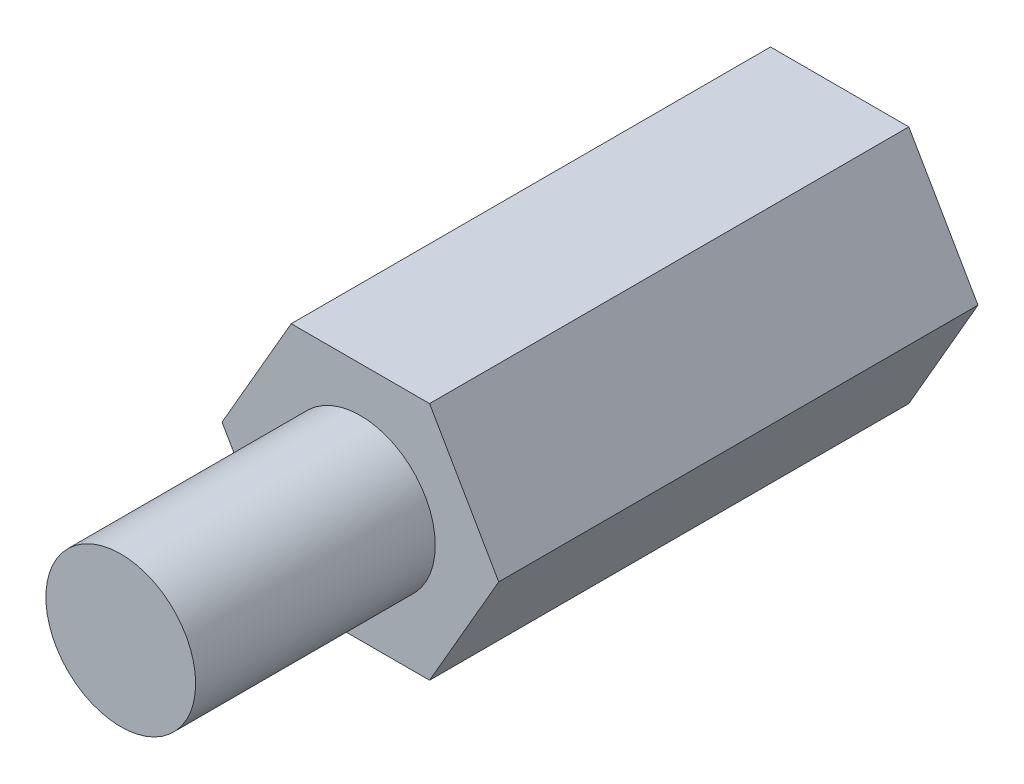
ISO-10303-21;
HEADER;
FILE_DESCRIPTION(('STEP AP214'),'2;1');
FILE_NAME('part.step','',(''),(''),'','','');
FILE_SCHEMA(('AUTOMOTIVE_DESIGN { 1 0 10303 214 1 1 1 1 }'));
ENDSEC;
DATA;
#1=APPLICATION_CONTEXT('core data for automotive mechanical design processes');
#2=APPLICATION_PROTOCOL_DEFINITION('international standard','automotive_design',2000,#1);
#3=PRODUCT_CONTEXT('',#1,'mechanical');
#4=PRODUCT('Part','Part','',(#3));
#5=PRODUCT_RELATED_PRODUCT_CATEGORY('part','',(#4));
#6=PRODUCT_DEFINITION_FORMATION('','',#4);
#7=PRODUCT_DEFINITION_CONTEXT('part definition',#1,'design');
#8=PRODUCT_DEFINITION('design','',#6,#7);
#9=PRODUCT_DEFINITION_SHAPE('','',#8);
#10=(LENGTH_UNIT() NAMED_UNIT(*) SI_UNIT(.MILLI.,.METRE.));
#11=(NAMED_UNIT(*) PLANE_ANGLE_UNIT() SI_UNIT($,.RADIAN.));
#12=(NAMED_UNIT(*) SI_UNIT($,.STERADIAN.) SOLID_ANGLE_UNIT());
#13=UNCERTAINTY_MEASURE_WITH_UNIT(LENGTH_MEASURE(1.E-05),#10,'distance_accuracy_value','');
#14=(GEOMETRIC_REPRESENTATION_CONTEXT(3) GLOBAL_UNCERTAINTY_ASSIGNED_CONTEXT((#13)) GLOBAL_UNIT_ASSIGNED_CONTEXT((#10,
#11,#12)) REPRESENTATION_CONTEXT('',''));
#15=CARTESIAN_POINT('',(0.,0.,0.));
#16=DIRECTION('',(0.,0.,1.));
#17=DIRECTION('',(1.,0.,0.));
#18=AXIS2_PLACEMENT_3D('',#15,#16,#17);
#19=CARTESIAN_POINT('',(-2.3094010767585,0.,8.));
#20=DIRECTION('',(0.866025403784439,0.5,0.));
#21=DIRECTION('',(-0.5,0.866025403784439,0.));
#22=AXIS2_PLACEMENT_3D('',#19,#20,#21);
#23=PLANE('',#22);
#24=DIRECTION('',(0.5,-0.866025403784439,0.));
#25=VECTOR('',#24,1.);
#26=CARTESIAN_POINT('',(-2.3094010767585,0.,0.));
#27=LINE('',#26,#25);
#28=CARTESIAN_POINT('',(-2.3094010767585,0.,0.));
#29=VERTEX_POINT('',#28);
#30=CARTESIAN_POINT('',(-1.15470053837925,-2.,0.));
#31=VERTEX_POINT('',#30);
#32=EDGE_CURVE('E125',#29,#31,#27,.T.);
#33=ORIENTED_EDGE('',*,*,#32,.T.);
#34=DIRECTION('',(0.,0.,-1.));
#35=VECTOR('',#34,1.);
#36=CARTESIAN_POINT('',(-1.15470053837925,-2.,8.));
#37=LINE('',#36,#35);
#38=CARTESIAN_POINT('',(-1.15470053837925,-2.,8.));
#39=VERTEX_POINT('',#38);
#40=EDGE_CURVE('E11',#39,#31,#37,.T.);
#41=ORIENTED_EDGE('',*,*,#40,.F.);
#42=DIRECTION('',(0.5,-0.866025403784439,0.));
#43=VECTOR('',#42,1.);
#44=CARTESIAN_POINT('',(-2.3094010767585,0.,8.));
#45=LINE('',#44,#43);
#46=CARTESIAN_POINT('',(-2.3094010767585,0.,8.));
#47=VERTEX_POINT('',#46);
#48=EDGE_CURVE('E136',#47,#39,#45,.T.);
#49=ORIENTED_EDGE('',*,*,#48,.F.);
#50=DIRECTION('',(0.,0.,-1.));
#51=VECTOR('',#50,1.);
#52=CARTESIAN_POINT('',(-2.3094010767585,0.,8.));
#53=LINE('',#52,#51);
#54=EDGE_CURVE('E121',#47,#29,#53,.T.);
#55=ORIENTED_EDGE('',*,*,#54,.T.);
#56=EDGE_LOOP('',(#33,#41,#49,#55));
#57=FACE_BOUND('',#56,.T.);
#58=ADVANCED_FACE('F39',(#57),#23,.F.);
#59=CARTESIAN_POINT('',(-1.15470053837925,-2.,8.));
#60=DIRECTION('',(0.,1.,0.));
#61=DIRECTION('',(0.,0.,1.));
#62=AXIS2_PLACEMENT_3D('',#59,#60,#61);
#63=PLANE('',#62);
#64=DIRECTION('',(1.,0.,0.));
#65=VECTOR('',#64,1.);
#66=CARTESIAN_POINT('',(-1.15470053837925,-2.,0.));
#67=LINE('',#66,#65);
#68=CARTESIAN_POINT('',(1.15470053837925,-2.,0.));
#69=VERTEX_POINT('',#68);
#70=EDGE_CURVE('E128',#31,#69,#67,.T.);
#71=ORIENTED_EDGE('',*,*,#70,.T.);
#72=DIRECTION('',(0.,0.,-1.));
#73=VECTOR('',#72,1.);
#74=CARTESIAN_POINT('',(1.15470053837925,-2.,8.));
#75=LINE('',#74,#73);
#76=CARTESIAN_POINT('',(1.15470053837925,-2.,8.));
#77=VERTEX_POINT('',#76);
#78=EDGE_CURVE('E47',#77,#69,#75,.T.);
#79=ORIENTED_EDGE('',*,*,#78,.F.);
#80=DIRECTION('',(1.,0.,0.));
#81=VECTOR('',#80,1.);
#82=CARTESIAN_POINT('',(-1.15470053837925,-2.,8.));
#83=LINE('',#82,#81);
#84=EDGE_CURVE('E93',#39,#77,#83,.T.);
#85=ORIENTED_EDGE('',*,*,#84,.F.);
#86=ORIENTED_EDGE('',*,*,#40,.T.);
#87=EDGE_LOOP('',(#71,#79,#85,#86));
#88=FACE_BOUND('',#87,.T.);
#89=ADVANCED_FACE('F161',(#88),#63,.F.);
#90=CARTESIAN_POINT('',(1.15470053837925,-2.,8.));
#91=DIRECTION('',(-0.866025403784439,0.5,0.));
#92=DIRECTION('',(-0.5,-0.866025403784439,0.));
#93=AXIS2_PLACEMENT_3D('',#90,#91,#92);
#94=PLANE('',#93);
#95=DIRECTION('',(0.5,0.866025403784439,0.));
#96=VECTOR('',#95,1.);
#97=CARTESIAN_POINT('',(1.15470053837925,-2.,0.));
#98=LINE('',#97,#96);
#99=CARTESIAN_POINT('',(2.3094010767585,0.,0.));
#100=VERTEX_POINT('',#99);
#101=EDGE_CURVE('E131',#69,#100,#98,.T.);
#102=ORIENTED_EDGE('',*,*,#101,.T.);
#103=DIRECTION('',(0.,0.,-1.));
#104=VECTOR('',#103,1.);
#105=CARTESIAN_POINT('',(2.3094010767585,0.,8.));
#106=LINE('',#105,#104);
#107=CARTESIAN_POINT('',(2.3094010767585,0.,8.));
#108=VERTEX_POINT('',#107);
#109=EDGE_CURVE('E116',#108,#100,#106,.T.);
#110=ORIENTED_EDGE('',*,*,#109,.F.);
#111=DIRECTION('',(0.5,0.866025403784439,0.));
#112=VECTOR('',#111,1.);
#113=CARTESIAN_POINT('',(1.15470053837925,-2.,8.));
#114=LINE('',#113,#112);
#115=EDGE_CURVE('E107',#77,#108,#114,.T.);
#116=ORIENTED_EDGE('',*,*,#115,.F.);
#117=ORIENTED_EDGE('',*,*,#78,.T.);
#118=EDGE_LOOP('',(#102,#110,#116,#117));
#119=FACE_BOUND('',#118,.T.);
#120=ADVANCED_FACE('F142',(#119),#94,.F.);
#121=CARTESIAN_POINT('',(2.3094010767585,0.,8.));
#122=DIRECTION('',(-0.866025403784438,-0.5,0.));
#123=DIRECTION('',(0.5,-0.866025403784438,0.));
#124=AXIS2_PLACEMENT_3D('',#121,#122,#123);
#125=PLANE('',#124);
#126=DIRECTION('',(-0.5,0.866025403784438,0.));
#127=VECTOR('',#126,1.);
#128=CARTESIAN_POINT('',(2.3094010767585,0.,0.));
#129=LINE('',#128,#127);
#130=CARTESIAN_POINT('',(1.15470053837925,2.,0.));
#131=VERTEX_POINT('',#130);
#132=EDGE_CURVE('E115',#100,#131,#129,.T.);
#133=ORIENTED_EDGE('',*,*,#132,.T.);
#134=DIRECTION('',(0.,0.,-1.));
#135=VECTOR('',#134,1.);
#136=CARTESIAN_POINT('',(1.15470053837925,2.,8.));
#137=LINE('',#136,#135);
#138=CARTESIAN_POINT('',(1.15470053837925,2.,8.));
#139=VERTEX_POINT('',#138);
#140=EDGE_CURVE('E112',#139,#131,#137,.T.);
#141=ORIENTED_EDGE('',*,*,#140,.F.);
#142=DIRECTION('',(-0.5,0.866025403784438,0.));
#143=VECTOR('',#142,1.);
#144=CARTESIAN_POINT('',(2.3094010767585,0.,8.));
#145=LINE('',#144,#143);
#146=EDGE_CURVE('E101',#108,#139,#145,.T.);
#147=ORIENTED_EDGE('',*,*,#146,.F.);
#148=ORIENTED_EDGE('',*,*,#109,.T.);
#149=EDGE_LOOP('',(#133,#141,#147,#148));
#150=FACE_BOUND('',#149,.T.);
#151=ADVANCED_FACE('F113',(#150),#125,.F.);
#152=CARTESIAN_POINT('',(1.15470053837925,2.,8.));
#153=DIRECTION('',(0.,-1.,0.));
#154=DIRECTION('',(1.,0.,0.));
#155=AXIS2_PLACEMENT_3D('',#152,#153,#154);
#156=PLANE('',#155);
#157=DIRECTION('',(-1.,0.,0.));
#158=VECTOR('',#157,1.);
#159=CARTESIAN_POINT('',(1.15470053837925,2.,0.));
#160=LINE('',#159,#158);
#161=CARTESIAN_POINT('',(-1.15470053837925,2.,0.));
#162=VERTEX_POINT('',#161);
#163=EDGE_CURVE('E79',#131,#162,#160,.T.);
#164=ORIENTED_EDGE('',*,*,#163,.T.);
#165=DIRECTION('',(0.,0.,-1.));
#166=VECTOR('',#165,1.);
#167=CARTESIAN_POINT('',(-1.15470053837925,2.,8.));
#168=LINE('',#167,#166);
#169=CARTESIAN_POINT('',(-1.15470053837925,2.,8.));
#170=VERTEX_POINT('',#169);
#171=EDGE_CURVE('E117',#170,#162,#168,.T.);
#172=ORIENTED_EDGE('',*,*,#171,.F.);
#173=DIRECTION('',(-1.,0.,0.));
#174=VECTOR('',#173,1.);
#175=CARTESIAN_POINT('',(1.15470053837925,2.,8.));
#176=LINE('',#175,#174);
#177=EDGE_CURVE('E105',#139,#170,#176,.T.);
#178=ORIENTED_EDGE('',*,*,#177,.F.);
#179=ORIENTED_EDGE('',*,*,#140,.T.);
#180=EDGE_LOOP('',(#164,#172,#178,#179));
#181=FACE_BOUND('',#180,.T.);
#182=ADVANCED_FACE('F119',(#181),#156,.F.);
#183=CARTESIAN_POINT('',(-1.15470053837925,2.,8.));
#184=DIRECTION('',(0.866025403784439,-0.5,0.));
#185=DIRECTION('',(0.5,0.866025403784439,0.));
#186=AXIS2_PLACEMENT_3D('',#183,#184,#185);
#187=PLANE('',#186);
#188=DIRECTION('',(-0.5,-0.866025403784439,0.));
#189=VECTOR('',#188,1.);
#190=CARTESIAN_POINT('',(-1.15470053837925,2.,0.));
#191=LINE('',#190,#189);
#192=EDGE_CURVE('E85',#162,#29,#191,.T.);
#193=ORIENTED_EDGE('',*,*,#192,.T.);
#194=ORIENTED_EDGE('',*,*,#54,.F.);
#195=DIRECTION('',(-0.5,-0.866025403784439,0.));
#196=VECTOR('',#195,1.);
#197=CARTESIAN_POINT('',(-1.15470053837925,2.,8.));
#198=LINE('',#197,#196);
#199=EDGE_CURVE('E55',#170,#47,#198,.T.);
#200=ORIENTED_EDGE('',*,*,#199,.F.);
#201=ORIENTED_EDGE('',*,*,#171,.T.);
#202=EDGE_LOOP('',(#193,#194,#200,#201));
#203=FACE_BOUND('',#202,.T.);
#204=ADVANCED_FACE('F149',(#203),#187,.F.);
#205=CARTESIAN_POINT('',(0.,0.,8.));
#206=DIRECTION('',(0.,0.,1.));
#207=DIRECTION('',(1.,0.,0.));
#208=AXIS2_PLACEMENT_3D('',#205,#206,#207);
#209=PLANE('',#208);
#210=CARTESIAN_POINT('',(0.,0.,8.));
#211=DIRECTION('',(0.,0.,1.));
#212=DIRECTION('',(1.,0.,0.));
#213=AXIS2_PLACEMENT_3D('',#210,#211,#212);
#214=CIRCLE('',#213,1.25);
#215=CARTESIAN_POINT('',(1.25,0.,8.));
#216=VERTEX_POINT('',#215);
#217=EDGE_CURVE('E251',#216,#216,#214,.T.);
#218=ORIENTED_EDGE('',*,*,#217,.F.);
#219=EDGE_LOOP('',(#218));
#220=FACE_BOUND('',#219,.T.);
#221=ORIENTED_EDGE('',*,*,#48,.T.);
#222=ORIENTED_EDGE('',*,*,#84,.T.);
#223=ORIENTED_EDGE('',*,*,#115,.T.);
#224=ORIENTED_EDGE('',*,*,#146,.T.);
#225=ORIENTED_EDGE('',*,*,#177,.T.);
#226=ORIENTED_EDGE('',*,*,#199,.T.);
#227=EDGE_LOOP('',(#221,#222,#223,#224,#225,#226));
#228=FACE_BOUND('',#227,.T.);
#229=ADVANCED_FACE('F103',(#220,#228),#209,.T.);
#230=CARTESIAN_POINT('',(0.,0.,0.));
#231=DIRECTION('',(0.,0.,1.));
#232=DIRECTION('',(1.,0.,0.));
#233=AXIS2_PLACEMENT_3D('',#230,#231,#232);
#234=PLANE('',#233);
#235=CARTESIAN_POINT('',(0.,0.,0.));
#236=DIRECTION('',(0.,0.,-1.));
#237=DIRECTION('',(-1.,0.,0.));
#238=AXIS2_PLACEMENT_3D('',#235,#236,#237);
#239=CIRCLE('',#238,1.025);
#240=CARTESIAN_POINT('',(-1.025,0.,0.));
#241=VERTEX_POINT('',#240);
#242=EDGE_CURVE('E249',#241,#241,#239,.T.);
#243=ORIENTED_EDGE('',*,*,#242,.F.);
#244=EDGE_LOOP('',(#243));
#245=FACE_BOUND('',#244,.T.);
#246=ORIENTED_EDGE('',*,*,#32,.F.);
#247=ORIENTED_EDGE('',*,*,#192,.F.);
#248=ORIENTED_EDGE('',*,*,#163,.F.);
#249=ORIENTED_EDGE('',*,*,#132,.F.);
#250=ORIENTED_EDGE('',*,*,#101,.F.);
#251=ORIENTED_EDGE('',*,*,#70,.F.);
#252=EDGE_LOOP('',(#246,#247,#248,#249,#250,#251));
#253=FACE_BOUND('',#252,.T.);
#254=ADVANCED_FACE('F145',(#245,#253),#234,.F.);
#255=CARTESIAN_POINT('',(0.,0.,12.));
#256=DIRECTION('',(0.,0.,-1.));
#257=DIRECTION('',(-1.,0.,0.));
#258=AXIS2_PLACEMENT_3D('',#255,#256,#257);
#259=CYLINDRICAL_SURFACE('',#258,1.25);
#260=CARTESIAN_POINT('',(0.,0.,12.));
#261=DIRECTION('',(0.,0.,1.));
#262=DIRECTION('',(1.,0.,0.));
#263=AXIS2_PLACEMENT_3D('',#260,#261,#262);
#264=CIRCLE('',#263,1.25);
#265=CARTESIAN_POINT('',(1.25,0.,12.));
#266=VERTEX_POINT('',#265);
#267=EDGE_CURVE('E129',#266,#266,#264,.T.);
#268=ORIENTED_EDGE('',*,*,#267,.F.);
#269=EDGE_LOOP('',(#268));
#270=FACE_BOUND('',#269,.T.);
#271=ORIENTED_EDGE('',*,*,#217,.T.);
#272=EDGE_LOOP('',(#271));
#273=FACE_BOUND('',#272,.T.);
#274=ADVANCED_FACE('F196',(#270,#273),#259,.T.);
#275=CARTESIAN_POINT('',(0.,0.,12.));
#276=DIRECTION('',(0.,0.,1.));
#277=DIRECTION('',(1.,0.,0.));
#278=AXIS2_PLACEMENT_3D('',#275,#276,#277);
#279=PLANE('',#278);
#280=ORIENTED_EDGE('',*,*,#267,.T.);
#281=EDGE_LOOP('',(#280));
#282=FACE_BOUND('',#281,.T.);
#283=ADVANCED_FACE('F201',(#282),#279,.T.);
#284=CARTESIAN_POINT('',(0.,0.,5.5));
#285=DIRECTION('',(0.,0.,-1.));
#286=DIRECTION('',(-1.,0.,0.));
#287=AXIS2_PLACEMENT_3D('',#284,#285,#286);
#288=CONICAL_SURFACE('',#287,1.025,1.02974425867665);
#289=CARTESIAN_POINT('',(0.,0.,6.11588213450325));
#290=VERTEX_POINT('',#289);
#291=VERTEX_LOOP('',#290);
#292=FACE_BOUND('',#291,.T.);
#293=CARTESIAN_POINT('',(0.,0.,5.5));
#294=DIRECTION('',(0.,0.,-1.));
#295=DIRECTION('',(-1.,0.,0.));
#296=AXIS2_PLACEMENT_3D('',#293,#294,#295);
#297=CIRCLE('',#296,1.025);
#298=CARTESIAN_POINT('',(-1.025,0.,5.5));
#299=VERTEX_POINT('',#298);
#300=EDGE_CURVE('E246',#299,#299,#297,.T.);
#301=ORIENTED_EDGE('',*,*,#300,.T.);
#302=EDGE_LOOP('',(#301));
#303=FACE_BOUND('',#302,.T.);
#304=ADVANCED_FACE('F211',(#292,#303),#288,.F.);
#305=CARTESIAN_POINT('',(0.,0.,0.));
#306=DIRECTION('',(0.,0.,-1.));
#307=DIRECTION('',(-1.,0.,0.));
#308=AXIS2_PLACEMENT_3D('',#305,#306,#307);
#309=CYLINDRICAL_SURFACE('',#308,1.025);
#310=ORIENTED_EDGE('',*,*,#300,.F.);
#311=EDGE_LOOP('',(#310));
#312=FACE_BOUND('',#311,.T.);
#313=ORIENTED_EDGE('',*,*,#242,.T.);
#314=EDGE_LOOP('',(#313));
#315=FACE_BOUND('',#314,.T.);
#316=ADVANCED_FACE('F227',(#312,#315),#309,.F.);
#317=CLOSED_SHELL('',(#58,#89,#120,#151,#182,#204,#229,#254,#274,#283,#304,#316));
#318=MANIFOLD_SOLID_BREP('B2',#317);
#319=ADVANCED_BREP_SHAPE_REPRESENTATION('',(#18,#318),#14);
#320=SHAPE_DEFINITION_REPRESENTATION(#9,#319);
ENDSEC;
END-ISO-10303-21;
